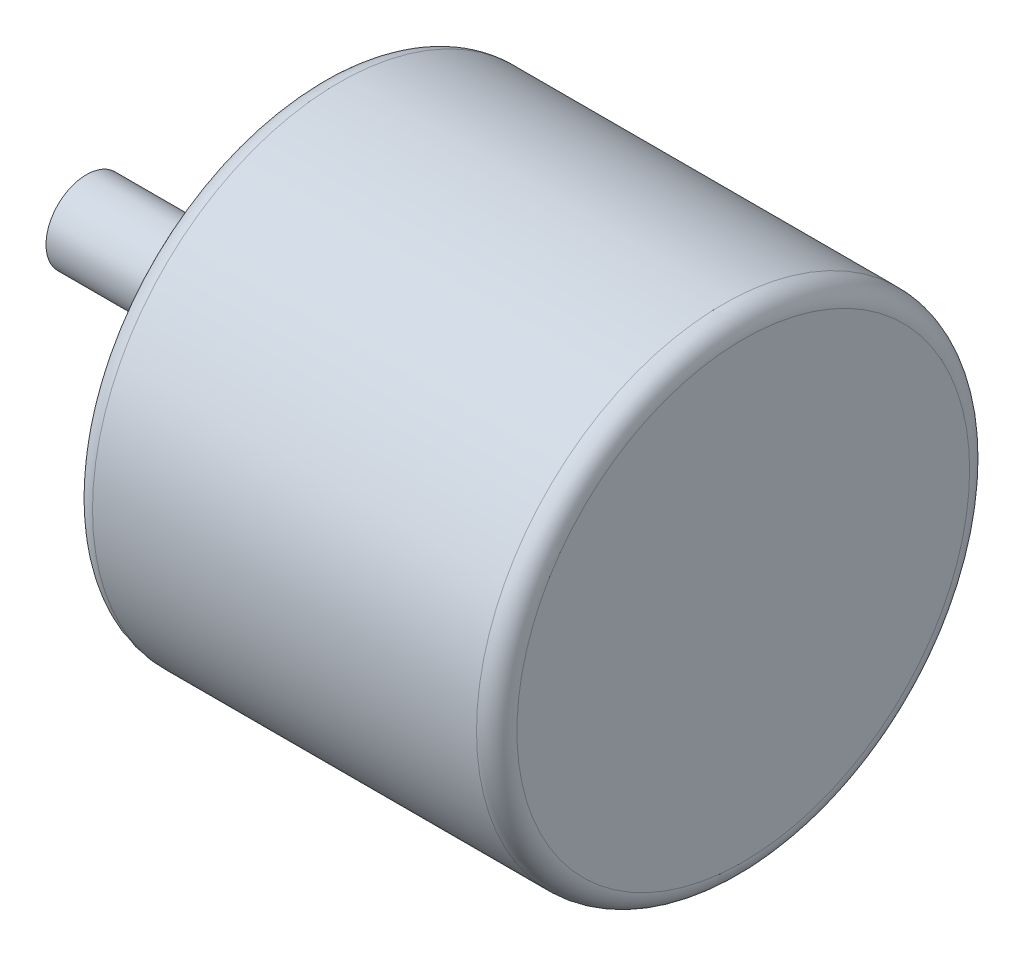
ISO-10303-21;
HEADER;
FILE_DESCRIPTION(('STEP AP214'),'2;1');
FILE_NAME('part.step','',(''),(''),'','','');
FILE_SCHEMA(('AUTOMOTIVE_DESIGN { 1 0 10303 214 1 1 1 1 }'));
ENDSEC;
DATA;
#1=APPLICATION_CONTEXT('core data for automotive mechanical design processes');
#2=APPLICATION_PROTOCOL_DEFINITION('international standard','automotive_design',2000,#1);
#3=PRODUCT_CONTEXT('',#1,'mechanical');
#4=PRODUCT('Part','Part','',(#3));
#5=PRODUCT_RELATED_PRODUCT_CATEGORY('part','',(#4));
#6=PRODUCT_DEFINITION_FORMATION('','',#4);
#7=PRODUCT_DEFINITION_CONTEXT('part definition',#1,'design');
#8=PRODUCT_DEFINITION('design','',#6,#7);
#9=PRODUCT_DEFINITION_SHAPE('','',#8);
#10=(LENGTH_UNIT() NAMED_UNIT(*) SI_UNIT(.MILLI.,.METRE.));
#11=(NAMED_UNIT(*) PLANE_ANGLE_UNIT() SI_UNIT($,.RADIAN.));
#12=(NAMED_UNIT(*) SI_UNIT($,.STERADIAN.) SOLID_ANGLE_UNIT());
#13=UNCERTAINTY_MEASURE_WITH_UNIT(LENGTH_MEASURE(1.E-05),#10,'distance_accuracy_value','');
#14=(GEOMETRIC_REPRESENTATION_CONTEXT(3) GLOBAL_UNCERTAINTY_ASSIGNED_CONTEXT((#13)) GLOBAL_UNIT_ASSIGNED_CONTEXT((#10,
#11,#12)) REPRESENTATION_CONTEXT('',''));
#15=CARTESIAN_POINT('',(0.,0.,0.));
#16=DIRECTION('',(0.,0.,1.));
#17=DIRECTION('',(1.,0.,0.));
#18=AXIS2_PLACEMENT_3D('',#15,#16,#17);
#19=CARTESIAN_POINT('',(21.,0.,0.));
#20=DIRECTION('',(-1.,0.,0.));
#21=DIRECTION('',(0.,0.,1.));
#22=AXIS2_PLACEMENT_3D('',#19,#20,#21);
#23=CYLINDRICAL_SURFACE('',#22,12.2);
#24=CARTESIAN_POINT('',(20.,0.,0.));
#25=DIRECTION('',(1.,0.,0.));
#26=DIRECTION('',(0.,0.,-1.));
#27=AXIS2_PLACEMENT_3D('',#24,#25,#26);
#28=CIRCLE('',#27,12.2);
#29=CARTESIAN_POINT('',(20.,0.,12.2));
#30=VERTEX_POINT('',#29);
#31=EDGE_CURVE('E67',#30,#30,#28,.F.);
#32=CARTESIAN_POINT('',(1.,0.,0.));
#33=DIRECTION('',(1.,0.,0.));
#34=DIRECTION('',(0.,0.,-1.));
#35=AXIS2_PLACEMENT_3D('',#32,#33,#34);
#36=CIRCLE('',#35,12.2);
#37=CARTESIAN_POINT('',(1.,0.,12.2));
#38=VERTEX_POINT('',#37);
#39=EDGE_CURVE('E63',#38,#38,#36,.T.);
#40=CARTESIAN_POINT('',(20.,0.,12.2));
#41=CARTESIAN_POINT('',(19.8020833333333,0.,12.2));
#42=CARTESIAN_POINT('',(19.6041666666667,0.,12.2));
#43=CARTESIAN_POINT('',(19.2083333333333,0.,12.2));
#44=CARTESIAN_POINT('',(19.0104166666667,0.,12.2));
#45=CARTESIAN_POINT('',(18.6145833333333,0.,12.2));
#46=CARTESIAN_POINT('',(18.4166666666667,0.,12.2));
#47=CARTESIAN_POINT('',(18.0208333333333,0.,12.2));
#48=CARTESIAN_POINT('',(17.8229166666667,0.,12.2));
#49=CARTESIAN_POINT('',(17.4270833333333,0.,12.2));
#50=CARTESIAN_POINT('',(17.2291666666667,0.,12.2));
#51=CARTESIAN_POINT('',(16.8333333333333,0.,12.2));
#52=CARTESIAN_POINT('',(16.6354166666667,0.,12.2));
#53=CARTESIAN_POINT('',(16.2395833333333,0.,12.2));
#54=CARTESIAN_POINT('',(16.0416666666667,0.,12.2));
#55=CARTESIAN_POINT('',(15.6458333333333,0.,12.2));
#56=CARTESIAN_POINT('',(15.4479166666667,0.,12.2));
#57=CARTESIAN_POINT('',(15.0520833333333,0.,12.2));
#58=CARTESIAN_POINT('',(14.8541666666667,0.,12.2));
#59=CARTESIAN_POINT('',(14.4583333333333,0.,12.2));
#60=CARTESIAN_POINT('',(14.2604166666667,0.,12.2));
#61=CARTESIAN_POINT('',(13.8645833333333,0.,12.2));
#62=CARTESIAN_POINT('',(13.6666666666667,0.,12.2));
#63=CARTESIAN_POINT('',(13.2708333333333,0.,12.2));
#64=CARTESIAN_POINT('',(13.0729166666667,0.,12.2));
#65=CARTESIAN_POINT('',(12.6770833333333,0.,12.2));
#66=CARTESIAN_POINT('',(12.4791666666667,0.,12.2));
#67=CARTESIAN_POINT('',(12.0833333333333,0.,12.2));
#68=CARTESIAN_POINT('',(11.8854166666667,0.,12.2));
#69=CARTESIAN_POINT('',(11.4895833333333,0.,12.2));
#70=CARTESIAN_POINT('',(11.2916666666667,0.,12.2));
#71=CARTESIAN_POINT('',(10.8958333333333,0.,12.2));
#72=CARTESIAN_POINT('',(10.6979166666667,0.,12.2));
#73=CARTESIAN_POINT('',(10.3020833333333,0.,12.2));
#74=CARTESIAN_POINT('',(10.1041666666667,0.,12.2));
#75=CARTESIAN_POINT('',(9.70833333333333,0.,12.2));
#76=CARTESIAN_POINT('',(9.51041666666667,0.,12.2));
#77=CARTESIAN_POINT('',(9.11458333333333,0.,12.2));
#78=CARTESIAN_POINT('',(8.91666666666666,0.,12.2));
#79=CARTESIAN_POINT('',(8.52083333333333,0.,12.2));
#80=CARTESIAN_POINT('',(8.32291666666667,0.,12.2));
#81=CARTESIAN_POINT('',(7.92708333333333,0.,12.2));
#82=CARTESIAN_POINT('',(7.72916666666666,0.,12.2));
#83=CARTESIAN_POINT('',(7.33333333333333,0.,12.2));
#84=CARTESIAN_POINT('',(7.13541666666667,0.,12.2));
#85=CARTESIAN_POINT('',(6.73958333333333,0.,12.2));
#86=CARTESIAN_POINT('',(6.54166666666667,0.,12.2));
#87=CARTESIAN_POINT('',(6.14583333333333,0.,12.2));
#88=CARTESIAN_POINT('',(5.94791666666666,0.,12.2));
#89=CARTESIAN_POINT('',(5.55208333333333,0.,12.2));
#90=CARTESIAN_POINT('',(5.35416666666667,0.,12.2));
#91=CARTESIAN_POINT('',(4.95833333333333,0.,12.2));
#92=CARTESIAN_POINT('',(4.76041666666667,0.,12.2));
#93=CARTESIAN_POINT('',(4.36458333333333,0.,12.2));
#94=CARTESIAN_POINT('',(4.16666666666667,0.,12.2));
#95=CARTESIAN_POINT('',(3.77083333333333,0.,12.2));
#96=CARTESIAN_POINT('',(3.57291666666667,0.,12.2));
#97=CARTESIAN_POINT('',(3.17708333333334,0.,12.2));
#98=CARTESIAN_POINT('',(2.97916666666667,0.,12.2));
#99=CARTESIAN_POINT('',(2.58333333333333,0.,12.2));
#100=CARTESIAN_POINT('',(2.38541666666667,0.,12.2));
#101=CARTESIAN_POINT('',(1.98958333333333,0.,12.2));
#102=CARTESIAN_POINT('',(1.79166666666667,0.,12.2));
#103=CARTESIAN_POINT('',(1.39583333333333,0.,12.2));
#104=CARTESIAN_POINT('',(1.19791666666667,0.,12.2));
#105=CARTESIAN_POINT('',(1.,0.,12.2));
#106=B_SPLINE_CURVE_WITH_KNOTS('',3,(#40,#41,#42,#43,#44,#45,#46,#47,#48,#49,#50,#51,#52,#53,
#54,#55,#56,#57,#58,#59,#60,#61,#62,#63,#64,#65,#66,#67,#68,#69,#70,#71,#72,#73,#74,#75,#76,#77,
#78,#79,#80,#81,#82,#83,#84,#85,#86,#87,#88,#89,#90,#91,#92,#93,#94,#95,#96,#97,#98,#99,#100,
#101,#102,#103,#104,#105),.UNSPECIFIED.,.F.,.F.,(4,2,2,2,2,2,2,2,2,2,2,2,2,2,2,2,2,2,2,2,2,2,2,
2,2,2,2,2,2,2,2,2,4),(0.,0.593750000000001,1.1875,1.78125,2.375,2.96875,3.5625,4.15625,4.75,
5.34375,5.9375,6.53125,7.125,7.71875,8.3125,8.90625,9.5,10.09375,10.6875,11.28125,11.875,
12.46875,13.0625,13.65625,14.25,14.84375,15.4375,16.03125,16.625,17.21875,17.8125,18.40625,19.),.UNSPECIFIED.);
#107=EDGE_CURVE('BSEAM37',#30,#38,#106,.T.);
#108=ORIENTED_EDGE('',*,*,#31,.T.);
#109=ORIENTED_EDGE('',*,*,#39,.T.);
#110=ORIENTED_EDGE('',*,*,#107,.T.);
#111=ORIENTED_EDGE('',*,*,#107,.F.);
#112=EDGE_LOOP('',(#108,#110,#109,#111));
#113=FACE_BOUND('',#112,.T.);
#114=ADVANCED_FACE('F37',(#113),#23,.T.);
#115=CARTESIAN_POINT('',(21.,0.,0.));
#116=DIRECTION('',(1.,0.,0.));
#117=DIRECTION('',(0.,0.,-1.));
#118=AXIS2_PLACEMENT_3D('',#115,#116,#117);
#119=PLANE('',#118);
#120=CARTESIAN_POINT('',(21.,0.,0.));
#121=DIRECTION('',(1.,0.,0.));
#122=DIRECTION('',(0.,0.,-1.));
#123=AXIS2_PLACEMENT_3D('',#120,#121,#122);
#124=CIRCLE('',#123,11.2);
#125=CARTESIAN_POINT('',(21.,0.,-11.2));
#126=VERTEX_POINT('',#125);
#127=EDGE_CURVE('E59',#126,#126,#124,.T.);
#128=ORIENTED_EDGE('',*,*,#127,.T.);
#129=EDGE_LOOP('',(#128));
#130=FACE_BOUND('',#129,.T.);
#131=ADVANCED_FACE('F83',(#130),#119,.T.);
#132=CARTESIAN_POINT('',(0.,0.,0.));
#133=DIRECTION('',(1.,0.,0.));
#134=DIRECTION('',(0.,0.,-1.));
#135=AXIS2_PLACEMENT_3D('',#132,#133,#134);
#136=PLANE('',#135);
#137=CARTESIAN_POINT('',(0.,0.,0.));
#138=DIRECTION('',(1.,0.,0.));
#139=DIRECTION('',(0.,0.,-1.));
#140=AXIS2_PLACEMENT_3D('',#137,#138,#139);
#141=CIRCLE('',#140,3.5);
#142=CARTESIAN_POINT('',(0.,0.,-3.5));
#143=VERTEX_POINT('',#142);
#144=EDGE_CURVE('E41',#143,#143,#141,.F.);
#145=ORIENTED_EDGE('',*,*,#144,.F.);
#146=EDGE_LOOP('',(#145));
#147=FACE_BOUND('',#146,.T.);
#148=CARTESIAN_POINT('',(0.,0.,0.));
#149=DIRECTION('',(1.,0.,0.));
#150=DIRECTION('',(0.,0.,-1.));
#151=AXIS2_PLACEMENT_3D('',#148,#149,#150);
#152=CIRCLE('',#151,11.2);
#153=CARTESIAN_POINT('',(0.,0.,-11.2));
#154=VERTEX_POINT('',#153);
#155=EDGE_CURVE('E51',#154,#154,#152,.F.);
#156=ORIENTED_EDGE('',*,*,#155,.T.);
#157=EDGE_LOOP('',(#156));
#158=FACE_BOUND('',#157,.T.);
#159=ADVANCED_FACE('F74',(#147,#158),#136,.F.);
#160=CARTESIAN_POINT('',(20.,0.,0.));
#161=DIRECTION('',(1.,0.,0.));
#162=DIRECTION('',(0.,0.,-1.));
#163=AXIS2_PLACEMENT_3D('',#160,#161,#162);
#164=TOROIDAL_SURFACE('',#163,11.2,1.);
#165=ORIENTED_EDGE('',*,*,#31,.F.);
#166=EDGE_LOOP('',(#165));
#167=FACE_BOUND('',#166,.T.);
#168=ORIENTED_EDGE('',*,*,#127,.F.);
#169=EDGE_LOOP('',(#168));
#170=FACE_BOUND('',#169,.T.);
#171=ADVANCED_FACE('F79',(#167,#170),#164,.T.);
#172=CARTESIAN_POINT('',(1.,0.,0.));
#173=DIRECTION('',(1.,0.,0.));
#174=DIRECTION('',(0.,0.,-1.));
#175=AXIS2_PLACEMENT_3D('',#172,#173,#174);
#176=TOROIDAL_SURFACE('',#175,11.2,1.);
#177=ORIENTED_EDGE('',*,*,#155,.F.);
#178=EDGE_LOOP('',(#177));
#179=FACE_BOUND('',#178,.T.);
#180=ORIENTED_EDGE('',*,*,#39,.F.);
#181=EDGE_LOOP('',(#180));
#182=FACE_BOUND('',#181,.T.);
#183=ADVANCED_FACE('F39',(#179,#182),#176,.T.);
#184=CARTESIAN_POINT('',(-2.5,0.,0.));
#185=DIRECTION('',(1.,0.,0.));
#186=DIRECTION('',(0.,0.,-1.));
#187=AXIS2_PLACEMENT_3D('',#184,#185,#186);
#188=CYLINDRICAL_SURFACE('',#187,3.5);
#189=CARTESIAN_POINT('',(-2.5,0.,0.));
#190=DIRECTION('',(-1.,0.,0.));
#191=DIRECTION('',(0.,0.,1.));
#192=AXIS2_PLACEMENT_3D('',#189,#190,#191);
#193=CIRCLE('',#192,3.5);
#194=CARTESIAN_POINT('',(-2.5,0.,3.5));
#195=VERTEX_POINT('',#194);
#196=EDGE_CURVE('E55',#195,#195,#193,.T.);
#197=ORIENTED_EDGE('',*,*,#196,.F.);
#198=EDGE_LOOP('',(#197));
#199=FACE_BOUND('',#198,.T.);
#200=ORIENTED_EDGE('',*,*,#144,.T.);
#201=EDGE_LOOP('',(#200));
#202=FACE_BOUND('',#201,.T.);
#203=ADVANCED_FACE('F78',(#199,#202),#188,.T.);
#204=CARTESIAN_POINT('',(-2.5,0.,0.));
#205=DIRECTION('',(-1.,0.,0.));
#206=DIRECTION('',(0.,0.,1.));
#207=AXIS2_PLACEMENT_3D('',#204,#205,#206);
#208=PLANE('',#207);
#209=CARTESIAN_POINT('',(-2.5,0.,0.));
#210=DIRECTION('',(-1.,0.,0.));
#211=DIRECTION('',(0.,0.,1.));
#212=AXIS2_PLACEMENT_3D('',#209,#210,#211);
#213=CIRCLE('',#212,2.);
#214=CARTESIAN_POINT('',(-2.5,0.,2.));
#215=VERTEX_POINT('',#214);
#216=EDGE_CURVE('E10',#215,#215,#213,.T.);
#217=ORIENTED_EDGE('',*,*,#216,.F.);
#218=EDGE_LOOP('',(#217));
#219=FACE_BOUND('',#218,.T.);
#220=ORIENTED_EDGE('',*,*,#196,.T.);
#221=EDGE_LOOP('',(#220));
#222=FACE_BOUND('',#221,.T.);
#223=ADVANCED_FACE('F106',(#219,#222),#208,.T.);
#224=CARTESIAN_POINT('',(-11.5,0.,0.));
#225=DIRECTION('',(1.,0.,0.));
#226=DIRECTION('',(0.,0.,-1.));
#227=AXIS2_PLACEMENT_3D('',#224,#225,#226);
#228=CYLINDRICAL_SURFACE('',#227,2.);
#229=CARTESIAN_POINT('',(-11.5,0.,0.));
#230=DIRECTION('',(-1.,0.,0.));
#231=DIRECTION('',(0.,0.,1.));
#232=AXIS2_PLACEMENT_3D('',#229,#230,#231);
#233=CIRCLE('',#232,2.);
#234=CARTESIAN_POINT('',(-11.5,0.,2.));
#235=VERTEX_POINT('',#234);
#236=EDGE_CURVE('E54',#235,#235,#233,.T.);
#237=ORIENTED_EDGE('',*,*,#236,.F.);
#238=EDGE_LOOP('',(#237));
#239=FACE_BOUND('',#238,.T.);
#240=ORIENTED_EDGE('',*,*,#216,.T.);
#241=EDGE_LOOP('',(#240));
#242=FACE_BOUND('',#241,.T.);
#243=ADVANCED_FACE('F112',(#239,#242),#228,.T.);
#244=CARTESIAN_POINT('',(-11.5,0.,0.));
#245=DIRECTION('',(-1.,0.,0.));
#246=DIRECTION('',(0.,0.,1.));
#247=AXIS2_PLACEMENT_3D('',#244,#245,#246);
#248=PLANE('',#247);
#249=ORIENTED_EDGE('',*,*,#236,.T.);
#250=EDGE_LOOP('',(#249));
#251=FACE_BOUND('',#250,.T.);
#252=ADVANCED_FACE('F119',(#251),#248,.T.);
#253=CLOSED_SHELL('',(#114,#131,#159,#171,#183,#203,#223,#243,#252));
#254=MANIFOLD_SOLID_BREP('B2',#253);
#255=ADVANCED_BREP_SHAPE_REPRESENTATION('',(#18,#254),#14);
#256=SHAPE_DEFINITION_REPRESENTATION(#9,#255);
ENDSEC;
END-ISO-10303-21;
